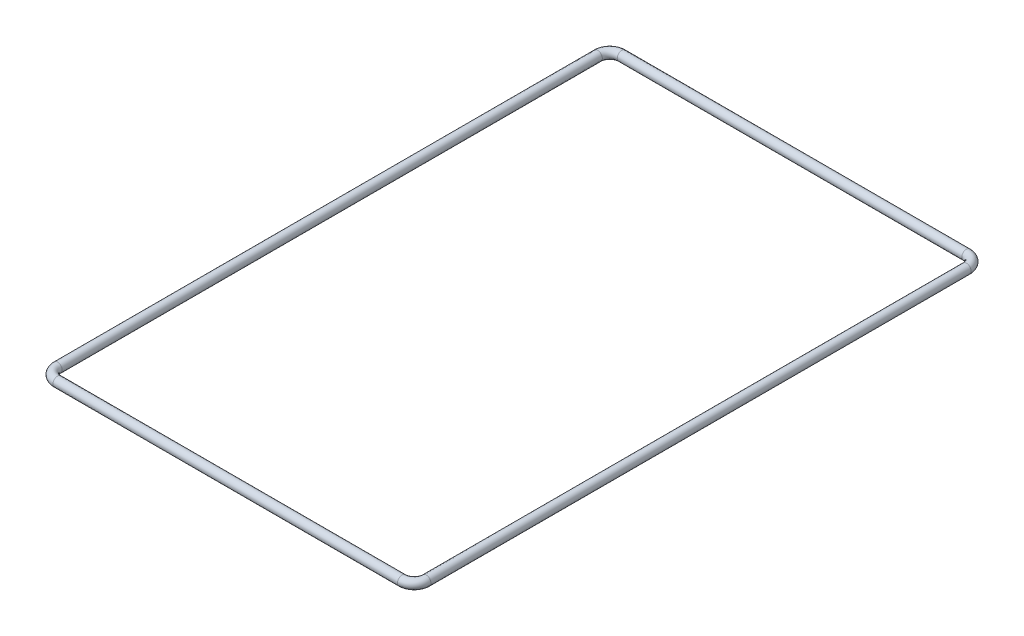
ISO-10303-21;
HEADER;
FILE_DESCRIPTION(('STEP AP214'),'2;1');
FILE_NAME('part.step','',(''),(''),'','','');
FILE_SCHEMA(('AUTOMOTIVE_DESIGN { 1 0 10303 214 1 1 1 1 }'));
ENDSEC;
DATA;
#1=APPLICATION_CONTEXT('core data for automotive mechanical design processes');
#2=APPLICATION_PROTOCOL_DEFINITION('international standard','automotive_design',2000,#1);
#3=PRODUCT_CONTEXT('',#1,'mechanical');
#4=PRODUCT('Part','Part','',(#3));
#5=PRODUCT_RELATED_PRODUCT_CATEGORY('part','',(#4));
#6=PRODUCT_DEFINITION_FORMATION('','',#4);
#7=PRODUCT_DEFINITION_CONTEXT('part definition',#1,'design');
#8=PRODUCT_DEFINITION('design','',#6,#7);
#9=PRODUCT_DEFINITION_SHAPE('','',#8);
#10=(LENGTH_UNIT() NAMED_UNIT(*) SI_UNIT(.MILLI.,.METRE.));
#11=(NAMED_UNIT(*) PLANE_ANGLE_UNIT() SI_UNIT($,.RADIAN.));
#12=(NAMED_UNIT(*) SI_UNIT($,.STERADIAN.) SOLID_ANGLE_UNIT());
#13=UNCERTAINTY_MEASURE_WITH_UNIT(LENGTH_MEASURE(1.E-05),#10,'distance_accuracy_value','');
#14=(GEOMETRIC_REPRESENTATION_CONTEXT(3) GLOBAL_UNCERTAINTY_ASSIGNED_CONTEXT((#13)) GLOBAL_UNIT_ASSIGNED_CONTEXT((#10,
#11,#12)) REPRESENTATION_CONTEXT('',''));
#15=CARTESIAN_POINT('',(0.,0.,0.));
#16=DIRECTION('',(0.,0.,1.));
#17=DIRECTION('',(1.,0.,0.));
#18=AXIS2_PLACEMENT_3D('',#15,#16,#17);
#19=CARTESIAN_POINT('',(88.8670176312185,0.,-150.569933948732));
#20=DIRECTION('',(0.,1.,0.));
#21=DIRECTION('',(0.,0.,1.));
#22=AXIS2_PLACEMENT_3D('',#19,#20,#21);
#23=TOROIDAL_SURFACE('',#22,6.50000000000001,2.5);
#24=CARTESIAN_POINT('',(95.3670176312185,0.,-150.569933948732));
#25=DIRECTION('',(0.,0.,-1.));
#26=DIRECTION('',(-1.,0.,0.));
#27=AXIS2_PLACEMENT_3D('',#24,#25,#26);
#28=CIRCLE('',#27,2.5);
#29=CARTESIAN_POINT('',(97.8670176312185,0.,-150.569933948732));
#30=VERTEX_POINT('',#29);
#31=EDGE_CURVE('E11',#30,#30,#28,.T.);
#32=CARTESIAN_POINT('',(88.8670176312185,0.,-157.069933948732));
#33=DIRECTION('',(-1.,0.,0.));
#34=DIRECTION('',(0.,0.,1.));
#35=AXIS2_PLACEMENT_3D('',#32,#33,#34);
#36=CIRCLE('',#35,2.5);
#37=CARTESIAN_POINT('',(88.8670176312185,0.,-159.569933948732));
#38=VERTEX_POINT('',#37);
#39=EDGE_CURVE('E70',#38,#38,#36,.T.);
#40=CARTESIAN_POINT('',(88.8670176312185,0.,-150.569933948732));
#41=DIRECTION('',(0.,1.,0.));
#42=DIRECTION('',(0.,0.,1.));
#43=AXIS2_PLACEMENT_3D('',#40,#41,#42);
#44=CIRCLE('',#43,9.00000000000001);
#45=EDGE_CURVE('',#30,#38,#44,.T.);
#46=ORIENTED_EDGE('',*,*,#31,.T.);
#47=ORIENTED_EDGE('',*,*,#39,.F.);
#48=ORIENTED_EDGE('',*,*,#45,.T.);
#49=ORIENTED_EDGE('',*,*,#45,.F.);
#50=EDGE_LOOP('',(#46,#48,#47,#49));
#51=FACE_BOUND('',#50,.T.);
#52=ADVANCED_FACE('F42',(#51),#23,.T.);
#53=CARTESIAN_POINT('',(95.3670176312185,0.,139.430066051268));
#54=DIRECTION('',(0.,0.,-1.));
#55=DIRECTION('',(-1.,0.,0.));
#56=AXIS2_PLACEMENT_3D('',#53,#54,#55);
#57=CYLINDRICAL_SURFACE('',#56,2.5);
#58=ORIENTED_EDGE('',*,*,#31,.F.);
#59=EDGE_LOOP('',(#58));
#60=FACE_BOUND('',#59,.T.);
#61=CARTESIAN_POINT('',(95.3670176312185,0.,139.430066051268));
#62=DIRECTION('',(0.,0.,-1.));
#63=DIRECTION('',(-1.,0.,0.));
#64=AXIS2_PLACEMENT_3D('',#61,#62,#63);
#65=CIRCLE('',#64,2.5);
#66=CARTESIAN_POINT('',(97.8670176312185,0.,139.430066051268));
#67=VERTEX_POINT('',#66);
#68=EDGE_CURVE('E48',#67,#67,#65,.T.);
#69=ORIENTED_EDGE('',*,*,#68,.T.);
#70=EDGE_LOOP('',(#69));
#71=FACE_BOUND('',#70,.T.);
#72=ADVANCED_FACE('F77',(#60,#71),#57,.T.);
#73=CARTESIAN_POINT('',(88.8670176312185,0.,139.430066051268));
#74=DIRECTION('',(0.,1.,0.));
#75=DIRECTION('',(0.,0.,1.));
#76=AXIS2_PLACEMENT_3D('',#73,#74,#75);
#77=TOROIDAL_SURFACE('',#76,6.50000000000001,2.5);
#78=CARTESIAN_POINT('',(88.8670176312185,0.,145.930066051268));
#79=DIRECTION('',(1.,0.,0.));
#80=DIRECTION('',(0.,0.,-1.));
#81=AXIS2_PLACEMENT_3D('',#78,#79,#80);
#82=CIRCLE('',#81,2.5);
#83=CARTESIAN_POINT('',(88.8670176312185,0.,148.430066051268));
#84=VERTEX_POINT('',#83);
#85=EDGE_CURVE('E52',#84,#84,#82,.T.);
#86=CARTESIAN_POINT('',(88.8670176312185,0.,139.430066051268));
#87=DIRECTION('',(0.,1.,0.));
#88=DIRECTION('',(0.,0.,1.));
#89=AXIS2_PLACEMENT_3D('',#86,#87,#88);
#90=CIRCLE('',#89,9.00000000000001);
#91=EDGE_CURVE('',#84,#67,#90,.T.);
#92=ORIENTED_EDGE('',*,*,#85,.T.);
#93=ORIENTED_EDGE('',*,*,#68,.F.);
#94=ORIENTED_EDGE('',*,*,#91,.T.);
#95=ORIENTED_EDGE('',*,*,#91,.F.);
#96=EDGE_LOOP('',(#92,#94,#93,#95));
#97=FACE_BOUND('',#96,.T.);
#98=ADVANCED_FACE('F81',(#97),#77,.T.);
#99=CARTESIAN_POINT('',(-96.1329823687815,0.,145.930066051268));
#100=DIRECTION('',(1.,0.,0.));
#101=DIRECTION('',(0.,0.,-1.));
#102=AXIS2_PLACEMENT_3D('',#99,#100,#101);
#103=CYLINDRICAL_SURFACE('',#102,2.5);
#104=ORIENTED_EDGE('',*,*,#85,.F.);
#105=EDGE_LOOP('',(#104));
#106=FACE_BOUND('',#105,.T.);
#107=CARTESIAN_POINT('',(-96.1329823687815,0.,145.930066051268));
#108=DIRECTION('',(1.,0.,0.));
#109=DIRECTION('',(0.,0.,-1.));
#110=AXIS2_PLACEMENT_3D('',#107,#108,#109);
#111=CIRCLE('',#110,2.5);
#112=CARTESIAN_POINT('',(-96.1329823687815,0.,148.430066051268));
#113=VERTEX_POINT('',#112);
#114=EDGE_CURVE('E56',#113,#113,#111,.T.);
#115=ORIENTED_EDGE('',*,*,#114,.T.);
#116=EDGE_LOOP('',(#115));
#117=FACE_BOUND('',#116,.T.);
#118=ADVANCED_FACE('F86',(#106,#117),#103,.T.);
#119=CARTESIAN_POINT('',(-96.1329823687815,0.,139.430066051268));
#120=DIRECTION('',(0.,1.,0.));
#121=DIRECTION('',(0.,0.,1.));
#122=AXIS2_PLACEMENT_3D('',#119,#120,#121);
#123=TOROIDAL_SURFACE('',#122,6.50000000000001,2.5);
#124=CARTESIAN_POINT('',(-102.632982368782,0.,139.430066051268));
#125=DIRECTION('',(0.,0.,1.));
#126=DIRECTION('',(1.,0.,0.));
#127=AXIS2_PLACEMENT_3D('',#124,#125,#126);
#128=CIRCLE('',#127,2.5);
#129=CARTESIAN_POINT('',(-105.132982368782,0.,139.430066051268));
#130=VERTEX_POINT('',#129);
#131=EDGE_CURVE('E61',#130,#130,#128,.T.);
#132=CARTESIAN_POINT('',(-96.1329823687815,0.,139.430066051268));
#133=DIRECTION('',(0.,1.,0.));
#134=DIRECTION('',(0.,0.,1.));
#135=AXIS2_PLACEMENT_3D('',#132,#133,#134);
#136=CIRCLE('',#135,9.00000000000001);
#137=EDGE_CURVE('',#130,#113,#136,.T.);
#138=ORIENTED_EDGE('',*,*,#131,.T.);
#139=ORIENTED_EDGE('',*,*,#114,.F.);
#140=ORIENTED_EDGE('',*,*,#137,.T.);
#141=ORIENTED_EDGE('',*,*,#137,.F.);
#142=EDGE_LOOP('',(#138,#140,#139,#141));
#143=FACE_BOUND('',#142,.T.);
#144=ADVANCED_FACE('F92',(#143),#123,.T.);
#145=CARTESIAN_POINT('',(-102.632982368782,0.,-150.569933948732));
#146=DIRECTION('',(0.,0.,1.));
#147=DIRECTION('',(1.,0.,0.));
#148=AXIS2_PLACEMENT_3D('',#145,#146,#147);
#149=CYLINDRICAL_SURFACE('',#148,2.5);
#150=ORIENTED_EDGE('',*,*,#131,.F.);
#151=EDGE_LOOP('',(#150));
#152=FACE_BOUND('',#151,.T.);
#153=CARTESIAN_POINT('',(-102.632982368782,0.,-150.569933948732));
#154=DIRECTION('',(0.,0.,1.));
#155=DIRECTION('',(1.,0.,0.));
#156=AXIS2_PLACEMENT_3D('',#153,#154,#155);
#157=CIRCLE('',#156,2.5);
#158=CARTESIAN_POINT('',(-105.132982368782,0.,-150.569933948732));
#159=VERTEX_POINT('',#158);
#160=EDGE_CURVE('E64',#159,#159,#157,.T.);
#161=ORIENTED_EDGE('',*,*,#160,.T.);
#162=EDGE_LOOP('',(#161));
#163=FACE_BOUND('',#162,.T.);
#164=ADVANCED_FACE('F96',(#152,#163),#149,.T.);
#165=CARTESIAN_POINT('',(-96.1329823687815,0.,-150.569933948732));
#166=DIRECTION('',(0.,1.,0.));
#167=DIRECTION('',(0.,0.,1.));
#168=AXIS2_PLACEMENT_3D('',#165,#166,#167);
#169=TOROIDAL_SURFACE('',#168,6.50000000000001,2.5);
#170=CARTESIAN_POINT('',(-96.1329823687815,0.,-157.069933948732));
#171=DIRECTION('',(-1.,0.,0.));
#172=DIRECTION('',(0.,0.,1.));
#173=AXIS2_PLACEMENT_3D('',#170,#171,#172);
#174=CIRCLE('',#173,2.5);
#175=CARTESIAN_POINT('',(-96.1329823687815,0.,-159.569933948732));
#176=VERTEX_POINT('',#175);
#177=EDGE_CURVE('E67',#176,#176,#174,.T.);
#178=CARTESIAN_POINT('',(-96.1329823687815,0.,-150.569933948732));
#179=DIRECTION('',(0.,1.,0.));
#180=DIRECTION('',(0.,0.,1.));
#181=AXIS2_PLACEMENT_3D('',#178,#179,#180);
#182=CIRCLE('',#181,9.00000000000001);
#183=EDGE_CURVE('',#176,#159,#182,.T.);
#184=ORIENTED_EDGE('',*,*,#177,.T.);
#185=ORIENTED_EDGE('',*,*,#160,.F.);
#186=ORIENTED_EDGE('',*,*,#183,.T.);
#187=ORIENTED_EDGE('',*,*,#183,.F.);
#188=EDGE_LOOP('',(#184,#186,#185,#187));
#189=FACE_BOUND('',#188,.T.);
#190=ADVANCED_FACE('F100',(#189),#169,.T.);
#191=CARTESIAN_POINT('',(88.8670176312185,0.,-157.069933948732));
#192=DIRECTION('',(-1.,0.,0.));
#193=DIRECTION('',(0.,0.,1.));
#194=AXIS2_PLACEMENT_3D('',#191,#192,#193);
#195=CYLINDRICAL_SURFACE('',#194,2.5);
#196=ORIENTED_EDGE('',*,*,#177,.F.);
#197=EDGE_LOOP('',(#196));
#198=FACE_BOUND('',#197,.T.);
#199=ORIENTED_EDGE('',*,*,#39,.T.);
#200=EDGE_LOOP('',(#199));
#201=FACE_BOUND('',#200,.T.);
#202=ADVANCED_FACE('F74',(#198,#201),#195,.T.);
#203=CLOSED_SHELL('',(#52,#72,#98,#118,#144,#164,#190,#202));
#204=MANIFOLD_SOLID_BREP('B2',#203);
#205=ADVANCED_BREP_SHAPE_REPRESENTATION('',(#18,#204),#14);
#206=SHAPE_DEFINITION_REPRESENTATION(#9,#205);
ENDSEC;
END-ISO-10303-21;
